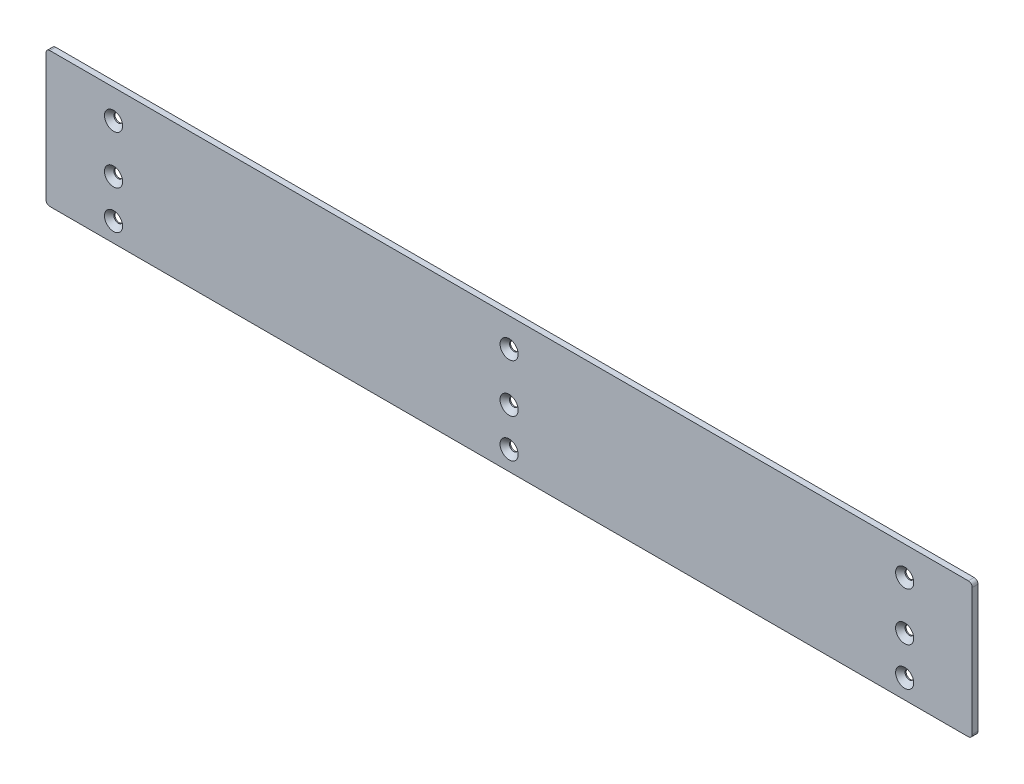
ISO-10303-21;
HEADER;
FILE_DESCRIPTION(('STEP AP214'),'2;1');
FILE_NAME('part.step','',(''),(''),'','','');
FILE_SCHEMA(('AUTOMOTIVE_DESIGN { 1 0 10303 214 1 1 1 1 }'));
ENDSEC;
DATA;
#1=APPLICATION_CONTEXT('core data for automotive mechanical design processes');
#2=APPLICATION_PROTOCOL_DEFINITION('international standard','automotive_design',2000,#1);
#3=PRODUCT_CONTEXT('',#1,'mechanical');
#4=PRODUCT('Part','Part','',(#3));
#5=PRODUCT_RELATED_PRODUCT_CATEGORY('part','',(#4));
#6=PRODUCT_DEFINITION_FORMATION('','',#4);
#7=PRODUCT_DEFINITION_CONTEXT('part definition',#1,'design');
#8=PRODUCT_DEFINITION('design','',#6,#7);
#9=PRODUCT_DEFINITION_SHAPE('','',#8);
#10=(LENGTH_UNIT() NAMED_UNIT(*) SI_UNIT(.MILLI.,.METRE.));
#11=(NAMED_UNIT(*) PLANE_ANGLE_UNIT() SI_UNIT($,.RADIAN.));
#12=(NAMED_UNIT(*) SI_UNIT($,.STERADIAN.) SOLID_ANGLE_UNIT());
#13=UNCERTAINTY_MEASURE_WITH_UNIT(LENGTH_MEASURE(1.E-05),#10,'distance_accuracy_value','');
#14=(GEOMETRIC_REPRESENTATION_CONTEXT(3) GLOBAL_UNCERTAINTY_ASSIGNED_CONTEXT((#13)) GLOBAL_UNIT_ASSIGNED_CONTEXT((#10,
#11,#12)) REPRESENTATION_CONTEXT('',''));
#15=CARTESIAN_POINT('',(0.,0.,0.));
#16=DIRECTION('',(0.,0.,1.));
#17=DIRECTION('',(1.,0.,0.));
#18=AXIS2_PLACEMENT_3D('',#15,#16,#17);
#19=CARTESIAN_POINT('',(-1.4210854715202E-13,0.,1.5));
#20=DIRECTION('',(0.,0.,1.));
#21=DIRECTION('',(1.,0.,0.));
#22=AXIS2_PLACEMENT_3D('',#19,#20,#21);
#23=PLANE('',#22);
#24=CARTESIAN_POINT('',(205.000057018662,-5.,1.5));
#25=DIRECTION('',(0.,0.,-1.));
#26=DIRECTION('',(1.,0.,0.));
#27=AXIS2_PLACEMENT_3D('',#24,#25,#26);
#28=CIRCLE('',#27,4.7);
#29=CARTESIAN_POINT('',(209.700057018662,-5.,1.5));
#30=VERTEX_POINT('',#29);
#31=EDGE_CURVE('E224',#30,#30,#28,.T.);
#32=ORIENTED_EDGE('',*,*,#31,.T.);
#33=EDGE_LOOP('',(#32));
#34=FACE_BOUND('',#33,.T.);
#35=CARTESIAN_POINT('',(-205.000057018662,-5.,1.5));
#36=DIRECTION('',(0.,0.,-1.));
#37=DIRECTION('',(1.,0.,0.));
#38=AXIS2_PLACEMENT_3D('',#35,#36,#37);
#39=CIRCLE('',#38,4.7);
#40=CARTESIAN_POINT('',(-200.300057018662,-5.,1.5));
#41=VERTEX_POINT('',#40);
#42=EDGE_CURVE('E167',#41,#41,#39,.T.);
#43=ORIENTED_EDGE('',*,*,#42,.T.);
#44=EDGE_LOOP('',(#43));
#45=FACE_BOUND('',#44,.T.);
#46=CARTESIAN_POINT('',(0.,20.,1.5));
#47=DIRECTION('',(0.,0.,-1.));
#48=DIRECTION('',(1.,0.,0.));
#49=AXIS2_PLACEMENT_3D('',#46,#47,#48);
#50=CIRCLE('',#49,4.7);
#51=CARTESIAN_POINT('',(4.7,20.,1.5));
#52=VERTEX_POINT('',#51);
#53=EDGE_CURVE('E160',#52,#52,#50,.T.);
#54=ORIENTED_EDGE('',*,*,#53,.T.);
#55=EDGE_LOOP('',(#54));
#56=FACE_BOUND('',#55,.T.);
#57=CARTESIAN_POINT('',(205.000057018662,20.,1.5));
#58=DIRECTION('',(0.,0.,-1.));
#59=DIRECTION('',(1.,0.,0.));
#60=AXIS2_PLACEMENT_3D('',#57,#58,#59);
#61=CIRCLE('',#60,4.7);
#62=CARTESIAN_POINT('',(209.700057018662,20.,1.5));
#63=VERTEX_POINT('',#62);
#64=EDGE_CURVE('E170',#63,#63,#61,.T.);
#65=ORIENTED_EDGE('',*,*,#64,.T.);
#66=EDGE_LOOP('',(#65));
#67=FACE_BOUND('',#66,.T.);
#68=CARTESIAN_POINT('',(-205.000057018662,20.,1.5));
#69=DIRECTION('',(0.,0.,-1.));
#70=DIRECTION('',(1.,0.,0.));
#71=AXIS2_PLACEMENT_3D('',#68,#69,#70);
#72=CIRCLE('',#71,4.7);
#73=CARTESIAN_POINT('',(-200.300057018662,20.,1.5));
#74=VERTEX_POINT('',#73);
#75=EDGE_CURVE('E194',#74,#74,#72,.T.);
#76=ORIENTED_EDGE('',*,*,#75,.T.);
#77=EDGE_LOOP('',(#76));
#78=FACE_BOUND('',#77,.T.);
#79=CARTESIAN_POINT('',(-205.000057018662,-25.,1.5));
#80=DIRECTION('',(0.,0.,-1.));
#81=DIRECTION('',(1.,0.,0.));
#82=AXIS2_PLACEMENT_3D('',#79,#80,#81);
#83=CIRCLE('',#82,4.7);
#84=CARTESIAN_POINT('',(-200.300057018662,-25.,1.5));
#85=VERTEX_POINT('',#84);
#86=EDGE_CURVE('E215',#85,#85,#83,.T.);
#87=ORIENTED_EDGE('',*,*,#86,.T.);
#88=EDGE_LOOP('',(#87));
#89=FACE_BOUND('',#88,.T.);
#90=CARTESIAN_POINT('',(205.000057018662,-25.,1.5));
#91=DIRECTION('',(0.,0.,-1.));
#92=DIRECTION('',(1.,0.,0.));
#93=AXIS2_PLACEMENT_3D('',#90,#91,#92);
#94=CIRCLE('',#93,4.7);
#95=CARTESIAN_POINT('',(209.700057018662,-25.,1.5));
#96=VERTEX_POINT('',#95);
#97=EDGE_CURVE('E198',#96,#96,#94,.T.);
#98=ORIENTED_EDGE('',*,*,#97,.T.);
#99=EDGE_LOOP('',(#98));
#100=FACE_BOUND('',#99,.T.);
#101=CARTESIAN_POINT('',(0.,-25.,1.5));
#102=DIRECTION('',(0.,0.,-1.));
#103=DIRECTION('',(1.,0.,0.));
#104=AXIS2_PLACEMENT_3D('',#101,#102,#103);
#105=CIRCLE('',#104,4.7);
#106=CARTESIAN_POINT('',(4.7,-25.,1.5));
#107=VERTEX_POINT('',#106);
#108=EDGE_CURVE('E183',#107,#107,#105,.T.);
#109=ORIENTED_EDGE('',*,*,#108,.T.);
#110=EDGE_LOOP('',(#109));
#111=FACE_BOUND('',#110,.T.);
#112=CARTESIAN_POINT('',(0.,-5.,1.5));
#113=DIRECTION('',(0.,0.,-1.));
#114=DIRECTION('',(1.,0.,0.));
#115=AXIS2_PLACEMENT_3D('',#112,#113,#114);
#116=CIRCLE('',#115,4.7);
#117=CARTESIAN_POINT('',(4.7,-5.,1.5));
#118=VERTEX_POINT('',#117);
#119=EDGE_CURVE('E184',#118,#118,#116,.T.);
#120=ORIENTED_EDGE('',*,*,#119,.T.);
#121=EDGE_LOOP('',(#120));
#122=FACE_BOUND('',#121,.T.);
#123=CARTESIAN_POINT('',(-238.,33.,1.5));
#124=DIRECTION('',(0.,0.,-1.));
#125=DIRECTION('',(-0.707106781186552,0.707106781186543,0.));
#126=AXIS2_PLACEMENT_3D('',#123,#124,#125);
#127=CIRCLE('',#126,2.);
#128=CARTESIAN_POINT('',(-240.,33.,1.5));
#129=VERTEX_POINT('',#128);
#130=CARTESIAN_POINT('',(-238.,35.,1.5));
#131=VERTEX_POINT('',#130);
#132=EDGE_CURVE('E230',#129,#131,#127,.T.);
#133=ORIENTED_EDGE('',*,*,#132,.F.);
#134=DIRECTION('',(0.,-1.,0.));
#135=VECTOR('',#134,1.);
#136=CARTESIAN_POINT('',(-240.,-35.,1.5));
#137=LINE('',#136,#135);
#138=CARTESIAN_POINT('',(-240.,-33.,1.5));
#139=VERTEX_POINT('',#138);
#140=EDGE_CURVE('E242',#129,#139,#137,.T.);
#141=ORIENTED_EDGE('',*,*,#140,.T.);
#142=CARTESIAN_POINT('',(-238.,-33.,1.5));
#143=DIRECTION('',(0.,0.,-1.));
#144=DIRECTION('',(-0.707106781186552,-0.707106781186543,0.));
#145=AXIS2_PLACEMENT_3D('',#142,#143,#144);
#146=CIRCLE('',#145,2.);
#147=CARTESIAN_POINT('',(-238.,-35.,1.5));
#148=VERTEX_POINT('',#147);
#149=EDGE_CURVE('E222',#148,#139,#146,.T.);
#150=ORIENTED_EDGE('',*,*,#149,.F.);
#151=DIRECTION('',(1.,0.,0.));
#152=VECTOR('',#151,1.);
#153=CARTESIAN_POINT('',(240.,-35.,1.5));
#154=LINE('',#153,#152);
#155=CARTESIAN_POINT('',(238.,-35.,1.5));
#156=VERTEX_POINT('',#155);
#157=EDGE_CURVE('E185',#148,#156,#154,.T.);
#158=ORIENTED_EDGE('',*,*,#157,.T.);
#159=CARTESIAN_POINT('',(238.,-33.,1.5));
#160=DIRECTION('',(0.,0.,-1.));
#161=DIRECTION('',(0.707106781186552,-0.707106781186543,0.));
#162=AXIS2_PLACEMENT_3D('',#159,#160,#161);
#163=CIRCLE('',#162,2.);
#164=CARTESIAN_POINT('',(240.,-33.,1.5));
#165=VERTEX_POINT('',#164);
#166=EDGE_CURVE('E206',#165,#156,#163,.T.);
#167=ORIENTED_EDGE('',*,*,#166,.F.);
#168=DIRECTION('',(0.,1.,0.));
#169=VECTOR('',#168,1.);
#170=CARTESIAN_POINT('',(240.,35.,1.5));
#171=LINE('',#170,#169);
#172=CARTESIAN_POINT('',(240.,33.,1.5));
#173=VERTEX_POINT('',#172);
#174=EDGE_CURVE('E207',#165,#173,#171,.T.);
#175=ORIENTED_EDGE('',*,*,#174,.T.);
#176=CARTESIAN_POINT('',(238.,33.,1.5));
#177=DIRECTION('',(0.,0.,-1.));
#178=DIRECTION('',(0.70710678118654,0.707106781186556,0.));
#179=AXIS2_PLACEMENT_3D('',#176,#177,#178);
#180=CIRCLE('',#179,2.);
#181=CARTESIAN_POINT('',(238.,35.,1.5));
#182=VERTEX_POINT('',#181);
#183=EDGE_CURVE('E214',#182,#173,#180,.T.);
#184=ORIENTED_EDGE('',*,*,#183,.F.);
#185=DIRECTION('',(-1.,0.,0.));
#186=VECTOR('',#185,1.);
#187=CARTESIAN_POINT('',(-240.,35.,1.5));
#188=LINE('',#187,#186);
#189=EDGE_CURVE('E10',#182,#131,#188,.T.);
#190=ORIENTED_EDGE('',*,*,#189,.T.);
#191=EDGE_LOOP('',(#133,#141,#150,#158,#167,#175,#184,#190));
#192=FACE_BOUND('',#191,.T.);
#193=ADVANCED_FACE('F15',(#34,#45,#56,#67,#78,#89,#100,#111,#122,#192),#23,.T.);
#194=CARTESIAN_POINT('',(240.,35.,0.));
#195=DIRECTION('',(0.,1.,0.));
#196=DIRECTION('',(-1.,0.,0.));
#197=AXIS2_PLACEMENT_3D('',#194,#195,#196);
#198=PLANE('',#197);
#199=DIRECTION('',(0.,0.,-1.));
#200=VECTOR('',#199,1.);
#201=CARTESIAN_POINT('',(-238.,35.,0.));
#202=LINE('',#201,#200);
#203=CARTESIAN_POINT('',(-238.,35.,-1.5));
#204=VERTEX_POINT('',#203);
#205=EDGE_CURVE('E233',#131,#204,#202,.T.);
#206=ORIENTED_EDGE('',*,*,#205,.F.);
#207=ORIENTED_EDGE('',*,*,#189,.F.);
#208=DIRECTION('',(0.,0.,1.));
#209=VECTOR('',#208,1.);
#210=CARTESIAN_POINT('',(238.,35.,0.));
#211=LINE('',#210,#209);
#212=CARTESIAN_POINT('',(238.,35.,-1.5));
#213=VERTEX_POINT('',#212);
#214=EDGE_CURVE('E189',#213,#182,#211,.T.);
#215=ORIENTED_EDGE('',*,*,#214,.F.);
#216=DIRECTION('',(1.,0.,0.));
#217=VECTOR('',#216,1.);
#218=CARTESIAN_POINT('',(-240.,35.,-1.5));
#219=LINE('',#218,#217);
#220=EDGE_CURVE('E178',#204,#213,#219,.T.);
#221=ORIENTED_EDGE('',*,*,#220,.F.);
#222=EDGE_LOOP('',(#206,#207,#215,#221));
#223=FACE_BOUND('',#222,.T.);
#224=ADVANCED_FACE('F284',(#223),#198,.T.);
#225=CARTESIAN_POINT('',(205.000057018662,-5.,-483.586590208387));
#226=DIRECTION('',(0.,0.,-1.));
#227=DIRECTION('',(1.,0.,0.));
#228=AXIS2_PLACEMENT_3D('',#225,#226,#227);
#229=CYLINDRICAL_SURFACE('',#228,2.25);
#230=CARTESIAN_POINT('',(205.000057018662,-5.,-0.950000000000045));
#231=DIRECTION('',(0.,0.,1.));
#232=DIRECTION('',(1.,0.,0.));
#233=AXIS2_PLACEMENT_3D('',#230,#231,#232);
#234=CIRCLE('',#233,2.25);
#235=CARTESIAN_POINT('',(207.250057018662,-5.,-0.95));
#236=VERTEX_POINT('',#235);
#237=EDGE_CURVE('E26',#236,#236,#234,.T.);
#238=ORIENTED_EDGE('',*,*,#237,.T.);
#239=EDGE_LOOP('',(#238));
#240=FACE_BOUND('',#239,.T.);
#241=CARTESIAN_POINT('',(205.000057018662,-5.,-1.49999999999999));
#242=DIRECTION('',(0.,0.,1.));
#243=DIRECTION('',(1.,0.,0.));
#244=AXIS2_PLACEMENT_3D('',#241,#242,#243);
#245=CIRCLE('',#244,2.25);
#246=CARTESIAN_POINT('',(202.750057018662,-5.,-1.49999999999999));
#247=VERTEX_POINT('',#246);
#248=EDGE_CURVE('E176',#247,#247,#245,.T.);
#249=ORIENTED_EDGE('',*,*,#248,.F.);
#250=EDGE_LOOP('',(#249));
#251=FACE_BOUND('',#250,.T.);
#252=ADVANCED_FACE('F290',(#240,#251),#229,.F.);
#253=CARTESIAN_POINT('',(205.000057018662,-5.,0.275));
#254=DIRECTION('',(0.,0.,1.));
#255=DIRECTION('',(1.,0.,0.));
#256=AXIS2_PLACEMENT_3D('',#253,#254,#255);
#257=CONICAL_SURFACE('',#256,3.475,0.785398163397448);
#258=ORIENTED_EDGE('',*,*,#237,.F.);
#259=EDGE_LOOP('',(#258));
#260=FACE_BOUND('',#259,.T.);
#261=ORIENTED_EDGE('',*,*,#31,.F.);
#262=EDGE_LOOP('',(#261));
#263=FACE_BOUND('',#262,.T.);
#264=ADVANCED_FACE('F414',(#260,#263),#257,.F.);
#265=CARTESIAN_POINT('',(-205.000057018662,-5.,-483.586590208387));
#266=DIRECTION('',(0.,0.,-1.));
#267=DIRECTION('',(1.,0.,0.));
#268=AXIS2_PLACEMENT_3D('',#265,#266,#267);
#269=CYLINDRICAL_SURFACE('',#268,2.25);
#270=CARTESIAN_POINT('',(-205.000057018662,-5.,-0.950000000000045));
#271=DIRECTION('',(0.,0.,1.));
#272=DIRECTION('',(1.,0.,0.));
#273=AXIS2_PLACEMENT_3D('',#270,#271,#272);
#274=CIRCLE('',#273,2.25);
#275=CARTESIAN_POINT('',(-202.750057018662,-5.,-0.95));
#276=VERTEX_POINT('',#275);
#277=EDGE_CURVE('E226',#276,#276,#274,.T.);
#278=ORIENTED_EDGE('',*,*,#277,.T.);
#279=EDGE_LOOP('',(#278));
#280=FACE_BOUND('',#279,.T.);
#281=CARTESIAN_POINT('',(-205.000057018662,-5.,-1.49999999999999));
#282=DIRECTION('',(0.,0.,1.));
#283=DIRECTION('',(1.,0.,0.));
#284=AXIS2_PLACEMENT_3D('',#281,#282,#283);
#285=CIRCLE('',#284,2.25);
#286=CARTESIAN_POINT('',(-207.250057018662,-5.,-1.49999999999999));
#287=VERTEX_POINT('',#286);
#288=EDGE_CURVE('E179',#287,#287,#285,.T.);
#289=ORIENTED_EDGE('',*,*,#288,.F.);
#290=EDGE_LOOP('',(#289));
#291=FACE_BOUND('',#290,.T.);
#292=ADVANCED_FACE('F412',(#280,#291),#269,.F.);
#293=CARTESIAN_POINT('',(-205.000057018662,-5.,0.275));
#294=DIRECTION('',(0.,0.,1.));
#295=DIRECTION('',(1.,0.,0.));
#296=AXIS2_PLACEMENT_3D('',#293,#294,#295);
#297=CONICAL_SURFACE('',#296,3.475,0.785398163397448);
#298=ORIENTED_EDGE('',*,*,#277,.F.);
#299=EDGE_LOOP('',(#298));
#300=FACE_BOUND('',#299,.T.);
#301=ORIENTED_EDGE('',*,*,#42,.F.);
#302=EDGE_LOOP('',(#301));
#303=FACE_BOUND('',#302,.T.);
#304=ADVANCED_FACE('F17',(#300,#303),#297,.F.);
#305=CARTESIAN_POINT('',(0.,20.,-483.586590208387));
#306=DIRECTION('',(0.,0.,-1.));
#307=DIRECTION('',(1.,0.,0.));
#308=AXIS2_PLACEMENT_3D('',#305,#306,#307);
#309=CYLINDRICAL_SURFACE('',#308,2.25);
#310=CARTESIAN_POINT('',(0.,20.,-0.950000000000045));
#311=DIRECTION('',(0.,0.,1.));
#312=DIRECTION('',(1.,0.,0.));
#313=AXIS2_PLACEMENT_3D('',#310,#311,#312);
#314=CIRCLE('',#313,2.25);
#315=CARTESIAN_POINT('',(2.25,20.,-0.95));
#316=VERTEX_POINT('',#315);
#317=EDGE_CURVE('E163',#316,#316,#314,.T.);
#318=ORIENTED_EDGE('',*,*,#317,.T.);
#319=EDGE_LOOP('',(#318));
#320=FACE_BOUND('',#319,.T.);
#321=CARTESIAN_POINT('',(0.,20.,-1.49999999999999));
#322=DIRECTION('',(0.,0.,1.));
#323=DIRECTION('',(1.,0.,0.));
#324=AXIS2_PLACEMENT_3D('',#321,#322,#323);
#325=CIRCLE('',#324,2.25);
#326=CARTESIAN_POINT('',(-2.25,20.,-1.49999999999999));
#327=VERTEX_POINT('',#326);
#328=EDGE_CURVE('E236',#327,#327,#325,.T.);
#329=ORIENTED_EDGE('',*,*,#328,.F.);
#330=EDGE_LOOP('',(#329));
#331=FACE_BOUND('',#330,.T.);
#332=ADVANCED_FACE('F445',(#320,#331),#309,.F.);
#333=CARTESIAN_POINT('',(0.,20.,0.275));
#334=DIRECTION('',(0.,0.,1.));
#335=DIRECTION('',(1.,0.,0.));
#336=AXIS2_PLACEMENT_3D('',#333,#334,#335);
#337=CONICAL_SURFACE('',#336,3.475,0.785398163397448);
#338=ORIENTED_EDGE('',*,*,#317,.F.);
#339=EDGE_LOOP('',(#338));
#340=FACE_BOUND('',#339,.T.);
#341=ORIENTED_EDGE('',*,*,#53,.F.);
#342=EDGE_LOOP('',(#341));
#343=FACE_BOUND('',#342,.T.);
#344=ADVANCED_FACE('F442',(#340,#343),#337,.F.);
#345=CARTESIAN_POINT('',(205.000057018662,20.,-483.586590208387));
#346=DIRECTION('',(0.,0.,-1.));
#347=DIRECTION('',(1.,0.,0.));
#348=AXIS2_PLACEMENT_3D('',#345,#346,#347);
#349=CYLINDRICAL_SURFACE('',#348,2.25);
#350=CARTESIAN_POINT('',(205.000057018662,20.,-0.950000000000045));
#351=DIRECTION('',(0.,0.,1.));
#352=DIRECTION('',(1.,0.,0.));
#353=AXIS2_PLACEMENT_3D('',#350,#351,#352);
#354=CIRCLE('',#353,2.25);
#355=CARTESIAN_POINT('',(207.250057018662,20.,-0.95));
#356=VERTEX_POINT('',#355);
#357=EDGE_CURVE('E164',#356,#356,#354,.T.);
#358=ORIENTED_EDGE('',*,*,#357,.T.);
#359=EDGE_LOOP('',(#358));
#360=FACE_BOUND('',#359,.T.);
#361=CARTESIAN_POINT('',(205.000057018662,20.,-1.49999999999999));
#362=DIRECTION('',(0.,0.,1.));
#363=DIRECTION('',(1.,0.,0.));
#364=AXIS2_PLACEMENT_3D('',#361,#362,#363);
#365=CIRCLE('',#364,2.25);
#366=CARTESIAN_POINT('',(202.750057018662,20.,-1.49999999999999));
#367=VERTEX_POINT('',#366);
#368=EDGE_CURVE('E234',#367,#367,#365,.T.);
#369=ORIENTED_EDGE('',*,*,#368,.F.);
#370=EDGE_LOOP('',(#369));
#371=FACE_BOUND('',#370,.T.);
#372=ADVANCED_FACE('F278',(#360,#371),#349,.F.);
#373=CARTESIAN_POINT('',(205.000057018662,20.,0.275));
#374=DIRECTION('',(0.,0.,1.));
#375=DIRECTION('',(1.,0.,0.));
#376=AXIS2_PLACEMENT_3D('',#373,#374,#375);
#377=CONICAL_SURFACE('',#376,3.475,0.785398163397448);
#378=ORIENTED_EDGE('',*,*,#357,.F.);
#379=EDGE_LOOP('',(#378));
#380=FACE_BOUND('',#379,.T.);
#381=ORIENTED_EDGE('',*,*,#64,.F.);
#382=EDGE_LOOP('',(#381));
#383=FACE_BOUND('',#382,.T.);
#384=ADVANCED_FACE('F267',(#380,#383),#377,.F.);
#385=CARTESIAN_POINT('',(-205.000057018662,20.,-483.586590208387));
#386=DIRECTION('',(0.,0.,-1.));
#387=DIRECTION('',(1.,0.,0.));
#388=AXIS2_PLACEMENT_3D('',#385,#386,#387);
#389=CYLINDRICAL_SURFACE('',#388,2.25);
#390=CARTESIAN_POINT('',(-205.000057018662,20.,-0.950000000000045));
#391=DIRECTION('',(0.,0.,1.));
#392=DIRECTION('',(1.,0.,0.));
#393=AXIS2_PLACEMENT_3D('',#390,#391,#392);
#394=CIRCLE('',#393,2.25);
#395=CARTESIAN_POINT('',(-202.750057018662,20.,-0.95));
#396=VERTEX_POINT('',#395);
#397=EDGE_CURVE('E196',#396,#396,#394,.T.);
#398=ORIENTED_EDGE('',*,*,#397,.T.);
#399=EDGE_LOOP('',(#398));
#400=FACE_BOUND('',#399,.T.);
#401=CARTESIAN_POINT('',(-205.000057018662,20.,-1.49999999999999));
#402=DIRECTION('',(0.,0.,1.));
#403=DIRECTION('',(1.,0.,0.));
#404=AXIS2_PLACEMENT_3D('',#401,#402,#403);
#405=CIRCLE('',#404,2.25);
#406=CARTESIAN_POINT('',(-207.250057018662,20.,-1.49999999999999));
#407=VERTEX_POINT('',#406);
#408=EDGE_CURVE('E237',#407,#407,#405,.T.);
#409=ORIENTED_EDGE('',*,*,#408,.F.);
#410=EDGE_LOOP('',(#409));
#411=FACE_BOUND('',#410,.T.);
#412=ADVANCED_FACE('F264',(#400,#411),#389,.F.);
#413=CARTESIAN_POINT('',(-205.000057018662,20.,0.275));
#414=DIRECTION('',(0.,0.,1.));
#415=DIRECTION('',(1.,0.,0.));
#416=AXIS2_PLACEMENT_3D('',#413,#414,#415);
#417=CONICAL_SURFACE('',#416,3.475,0.785398163397448);
#418=ORIENTED_EDGE('',*,*,#397,.F.);
#419=EDGE_LOOP('',(#418));
#420=FACE_BOUND('',#419,.T.);
#421=ORIENTED_EDGE('',*,*,#75,.F.);
#422=EDGE_LOOP('',(#421));
#423=FACE_BOUND('',#422,.T.);
#424=ADVANCED_FACE('F266',(#420,#423),#417,.F.);
#425=CARTESIAN_POINT('',(-205.000057018662,-25.,-483.586590208387));
#426=DIRECTION('',(0.,0.,-1.));
#427=DIRECTION('',(1.,0.,0.));
#428=AXIS2_PLACEMENT_3D('',#425,#426,#427);
#429=CYLINDRICAL_SURFACE('',#428,2.25);
#430=CARTESIAN_POINT('',(-205.000057018662,-25.,-0.950000000000045));
#431=DIRECTION('',(0.,0.,1.));
#432=DIRECTION('',(1.,0.,0.));
#433=AXIS2_PLACEMENT_3D('',#430,#431,#432);
#434=CIRCLE('',#433,2.25);
#435=CARTESIAN_POINT('',(-202.750057018662,-25.,-0.95));
#436=VERTEX_POINT('',#435);
#437=EDGE_CURVE('E197',#436,#436,#434,.T.);
#438=ORIENTED_EDGE('',*,*,#437,.T.);
#439=EDGE_LOOP('',(#438));
#440=FACE_BOUND('',#439,.T.);
#441=CARTESIAN_POINT('',(-205.000057018662,-25.,-1.49999999999999));
#442=DIRECTION('',(0.,0.,1.));
#443=DIRECTION('',(1.,0.,0.));
#444=AXIS2_PLACEMENT_3D('',#441,#442,#443);
#445=CIRCLE('',#444,2.25);
#446=CARTESIAN_POINT('',(-207.250057018662,-25.,-1.49999999999999));
#447=VERTEX_POINT('',#446);
#448=EDGE_CURVE('E258',#447,#447,#445,.T.);
#449=ORIENTED_EDGE('',*,*,#448,.F.);
#450=EDGE_LOOP('',(#449));
#451=FACE_BOUND('',#450,.T.);
#452=ADVANCED_FACE('F275',(#440,#451),#429,.F.);
#453=CARTESIAN_POINT('',(-205.000057018662,-25.,0.275));
#454=DIRECTION('',(0.,0.,1.));
#455=DIRECTION('',(1.,0.,0.));
#456=AXIS2_PLACEMENT_3D('',#453,#454,#455);
#457=CONICAL_SURFACE('',#456,3.475,0.785398163397448);
#458=ORIENTED_EDGE('',*,*,#437,.F.);
#459=EDGE_LOOP('',(#458));
#460=FACE_BOUND('',#459,.T.);
#461=ORIENTED_EDGE('',*,*,#86,.F.);
#462=EDGE_LOOP('',(#461));
#463=FACE_BOUND('',#462,.T.);
#464=ADVANCED_FACE('F298',(#460,#463),#457,.F.);
#465=CARTESIAN_POINT('',(205.000057018662,-25.,-483.586590208387));
#466=DIRECTION('',(0.,0.,-1.));
#467=DIRECTION('',(1.,0.,0.));
#468=AXIS2_PLACEMENT_3D('',#465,#466,#467);
#469=CYLINDRICAL_SURFACE('',#468,2.25);
#470=CARTESIAN_POINT('',(205.000057018662,-25.,-0.950000000000045));
#471=DIRECTION('',(0.,0.,1.));
#472=DIRECTION('',(1.,0.,0.));
#473=AXIS2_PLACEMENT_3D('',#470,#471,#472);
#474=CIRCLE('',#473,2.25);
#475=CARTESIAN_POINT('',(207.250057018662,-25.,-0.95));
#476=VERTEX_POINT('',#475);
#477=EDGE_CURVE('E200',#476,#476,#474,.T.);
#478=ORIENTED_EDGE('',*,*,#477,.T.);
#479=EDGE_LOOP('',(#478));
#480=FACE_BOUND('',#479,.T.);
#481=CARTESIAN_POINT('',(205.000057018662,-25.,-1.49999999999999));
#482=DIRECTION('',(0.,0.,1.));
#483=DIRECTION('',(1.,0.,0.));
#484=AXIS2_PLACEMENT_3D('',#481,#482,#483);
#485=CIRCLE('',#484,2.25);
#486=CARTESIAN_POINT('',(202.750057018662,-25.,-1.49999999999999));
#487=VERTEX_POINT('',#486);
#488=EDGE_CURVE('E192',#487,#487,#485,.T.);
#489=ORIENTED_EDGE('',*,*,#488,.F.);
#490=EDGE_LOOP('',(#489));
#491=FACE_BOUND('',#490,.T.);
#492=ADVANCED_FACE('F303',(#480,#491),#469,.F.);
#493=CARTESIAN_POINT('',(205.000057018662,-25.,0.275));
#494=DIRECTION('',(0.,0.,1.));
#495=DIRECTION('',(1.,0.,0.));
#496=AXIS2_PLACEMENT_3D('',#493,#494,#495);
#497=CONICAL_SURFACE('',#496,3.475,0.785398163397448);
#498=ORIENTED_EDGE('',*,*,#477,.F.);
#499=EDGE_LOOP('',(#498));
#500=FACE_BOUND('',#499,.T.);
#501=ORIENTED_EDGE('',*,*,#97,.F.);
#502=EDGE_LOOP('',(#501));
#503=FACE_BOUND('',#502,.T.);
#504=ADVANCED_FACE('F429',(#500,#503),#497,.F.);
#505=CARTESIAN_POINT('',(0.,-25.,-483.586590208387));
#506=DIRECTION('',(0.,0.,-1.));
#507=DIRECTION('',(1.,0.,0.));
#508=AXIS2_PLACEMENT_3D('',#505,#506,#507);
#509=CYLINDRICAL_SURFACE('',#508,2.25);
#510=CARTESIAN_POINT('',(0.,-25.,-0.950000000000045));
#511=DIRECTION('',(0.,0.,1.));
#512=DIRECTION('',(1.,0.,0.));
#513=AXIS2_PLACEMENT_3D('',#510,#511,#512);
#514=CIRCLE('',#513,2.25);
#515=CARTESIAN_POINT('',(2.25,-25.,-0.95));
#516=VERTEX_POINT('',#515);
#517=EDGE_CURVE('E201',#516,#516,#514,.T.);
#518=ORIENTED_EDGE('',*,*,#517,.T.);
#519=EDGE_LOOP('',(#518));
#520=FACE_BOUND('',#519,.T.);
#521=CARTESIAN_POINT('',(0.,-25.,-1.49999999999999));
#522=DIRECTION('',(0.,0.,1.));
#523=DIRECTION('',(1.,0.,0.));
#524=AXIS2_PLACEMENT_3D('',#521,#522,#523);
#525=CIRCLE('',#524,2.25);
#526=CARTESIAN_POINT('',(-2.25,-25.,-1.49999999999999));
#527=VERTEX_POINT('',#526);
#528=EDGE_CURVE('E190',#527,#527,#525,.T.);
#529=ORIENTED_EDGE('',*,*,#528,.F.);
#530=EDGE_LOOP('',(#529));
#531=FACE_BOUND('',#530,.T.);
#532=ADVANCED_FACE('F373',(#520,#531),#509,.F.);
#533=CARTESIAN_POINT('',(0.,-25.,0.275));
#534=DIRECTION('',(0.,0.,1.));
#535=DIRECTION('',(1.,0.,0.));
#536=AXIS2_PLACEMENT_3D('',#533,#534,#535);
#537=CONICAL_SURFACE('',#536,3.475,0.785398163397448);
#538=ORIENTED_EDGE('',*,*,#517,.F.);
#539=EDGE_LOOP('',(#538));
#540=FACE_BOUND('',#539,.T.);
#541=ORIENTED_EDGE('',*,*,#108,.F.);
#542=EDGE_LOOP('',(#541));
#543=FACE_BOUND('',#542,.T.);
#544=ADVANCED_FACE('F368',(#540,#543),#537,.F.);
#545=CARTESIAN_POINT('',(0.,-5.,-483.586590208387));
#546=DIRECTION('',(0.,0.,-1.));
#547=DIRECTION('',(1.,0.,0.));
#548=AXIS2_PLACEMENT_3D('',#545,#546,#547);
#549=CYLINDRICAL_SURFACE('',#548,2.25);
#550=CARTESIAN_POINT('',(0.,-5.,-0.950000000000045));
#551=DIRECTION('',(0.,0.,1.));
#552=DIRECTION('',(1.,0.,0.));
#553=AXIS2_PLACEMENT_3D('',#550,#551,#552);
#554=CIRCLE('',#553,2.25);
#555=CARTESIAN_POINT('',(2.25,-5.,-0.95));
#556=VERTEX_POINT('',#555);
#557=EDGE_CURVE('E180',#556,#556,#554,.T.);
#558=ORIENTED_EDGE('',*,*,#557,.T.);
#559=EDGE_LOOP('',(#558));
#560=FACE_BOUND('',#559,.T.);
#561=CARTESIAN_POINT('',(0.,-5.,-1.49999999999999));
#562=DIRECTION('',(0.,0.,1.));
#563=DIRECTION('',(1.,0.,0.));
#564=AXIS2_PLACEMENT_3D('',#561,#562,#563);
#565=CIRCLE('',#564,2.25);
#566=CARTESIAN_POINT('',(-2.25,-5.,-1.49999999999999));
#567=VERTEX_POINT('',#566);
#568=EDGE_CURVE('E193',#567,#567,#565,.T.);
#569=ORIENTED_EDGE('',*,*,#568,.F.);
#570=EDGE_LOOP('',(#569));
#571=FACE_BOUND('',#570,.T.);
#572=ADVANCED_FACE('F365',(#560,#571),#549,.F.);
#573=CARTESIAN_POINT('',(0.,-5.,0.275));
#574=DIRECTION('',(0.,0.,1.));
#575=DIRECTION('',(1.,0.,0.));
#576=AXIS2_PLACEMENT_3D('',#573,#574,#575);
#577=CONICAL_SURFACE('',#576,3.475,0.785398163397448);
#578=ORIENTED_EDGE('',*,*,#557,.F.);
#579=EDGE_LOOP('',(#578));
#580=FACE_BOUND('',#579,.T.);
#581=ORIENTED_EDGE('',*,*,#119,.F.);
#582=EDGE_LOOP('',(#581));
#583=FACE_BOUND('',#582,.T.);
#584=ADVANCED_FACE('F295',(#580,#583),#577,.F.);
#585=CARTESIAN_POINT('',(238.,-33.,0.));
#586=DIRECTION('',(0.,0.,1.));
#587=DIRECTION('',(0.707106781186552,-0.707106781186543,0.));
#588=AXIS2_PLACEMENT_3D('',#585,#586,#587);
#589=CYLINDRICAL_SURFACE('',#588,2.);
#590=CARTESIAN_POINT('',(238.,-33.,-1.5));
#591=DIRECTION('',(0.,0.,1.));
#592=DIRECTION('',(0.707106781186552,-0.707106781186543,0.));
#593=AXIS2_PLACEMENT_3D('',#590,#591,#592);
#594=CIRCLE('',#593,2.);
#595=CARTESIAN_POINT('',(238.,-35.,-1.5));
#596=VERTEX_POINT('',#595);
#597=CARTESIAN_POINT('',(240.,-33.,-1.5));
#598=VERTEX_POINT('',#597);
#599=EDGE_CURVE('E257',#596,#598,#594,.T.);
#600=ORIENTED_EDGE('',*,*,#599,.T.);
#601=DIRECTION('',(0.,0.,1.));
#602=VECTOR('',#601,1.);
#603=CARTESIAN_POINT('',(240.,-33.,0.));
#604=LINE('',#603,#602);
#605=EDGE_CURVE('E203',#598,#165,#604,.T.);
#606=ORIENTED_EDGE('',*,*,#605,.T.);
#607=ORIENTED_EDGE('',*,*,#166,.T.);
#608=DIRECTION('',(0.,0.,-1.));
#609=VECTOR('',#608,1.);
#610=CARTESIAN_POINT('',(238.,-35.,0.));
#611=LINE('',#610,#609);
#612=EDGE_CURVE('E19',#156,#596,#611,.T.);
#613=ORIENTED_EDGE('',*,*,#612,.T.);
#614=EDGE_LOOP('',(#600,#606,#607,#613));
#615=FACE_BOUND('',#614,.T.);
#616=ADVANCED_FACE('F356',(#615),#589,.T.);
#617=CARTESIAN_POINT('',(240.,-35.,0.));
#618=DIRECTION('',(1.,0.,0.));
#619=DIRECTION('',(0.,1.,0.));
#620=AXIS2_PLACEMENT_3D('',#617,#618,#619);
#621=PLANE('',#620);
#622=DIRECTION('',(0.,0.,-1.));
#623=VECTOR('',#622,1.);
#624=CARTESIAN_POINT('',(240.,33.,0.));
#625=LINE('',#624,#623);
#626=CARTESIAN_POINT('',(240.,33.,-1.5));
#627=VERTEX_POINT('',#626);
#628=EDGE_CURVE('E212',#173,#627,#625,.T.);
#629=ORIENTED_EDGE('',*,*,#628,.F.);
#630=ORIENTED_EDGE('',*,*,#174,.F.);
#631=ORIENTED_EDGE('',*,*,#605,.F.);
#632=DIRECTION('',(0.,-1.,0.));
#633=VECTOR('',#632,1.);
#634=CARTESIAN_POINT('',(240.,35.,-1.5));
#635=LINE('',#634,#633);
#636=EDGE_CURVE('E211',#627,#598,#635,.T.);
#637=ORIENTED_EDGE('',*,*,#636,.F.);
#638=EDGE_LOOP('',(#629,#630,#631,#637));
#639=FACE_BOUND('',#638,.T.);
#640=ADVANCED_FACE('F353',(#639),#621,.T.);
#641=CARTESIAN_POINT('',(238.,33.,0.));
#642=DIRECTION('',(0.,0.,1.));
#643=DIRECTION('',(0.70710678118654,0.707106781186556,0.));
#644=AXIS2_PLACEMENT_3D('',#641,#642,#643);
#645=CYLINDRICAL_SURFACE('',#644,2.);
#646=CARTESIAN_POINT('',(238.,33.,-1.5));
#647=DIRECTION('',(0.,0.,1.));
#648=DIRECTION('',(0.70710678118654,0.707106781186556,0.));
#649=AXIS2_PLACEMENT_3D('',#646,#647,#648);
#650=CIRCLE('',#649,2.);
#651=EDGE_CURVE('E208',#627,#213,#650,.T.);
#652=ORIENTED_EDGE('',*,*,#651,.T.);
#653=ORIENTED_EDGE('',*,*,#214,.T.);
#654=ORIENTED_EDGE('',*,*,#183,.T.);
#655=ORIENTED_EDGE('',*,*,#628,.T.);
#656=EDGE_LOOP('',(#652,#653,#654,#655));
#657=FACE_BOUND('',#656,.T.);
#658=ADVANCED_FACE('F363',(#657),#645,.T.);
#659=CARTESIAN_POINT('',(-240.,-35.,0.));
#660=DIRECTION('',(0.,-1.,0.));
#661=DIRECTION('',(1.,0.,0.));
#662=AXIS2_PLACEMENT_3D('',#659,#660,#661);
#663=PLANE('',#662);
#664=DIRECTION('',(0.,0.,1.));
#665=VECTOR('',#664,1.);
#666=CARTESIAN_POINT('',(-238.,-35.,0.));
#667=LINE('',#666,#665);
#668=CARTESIAN_POINT('',(-238.,-35.,-1.5));
#669=VERTEX_POINT('',#668);
#670=EDGE_CURVE('E115',#669,#148,#667,.T.);
#671=ORIENTED_EDGE('',*,*,#670,.F.);
#672=DIRECTION('',(-1.,0.,0.));
#673=VECTOR('',#672,1.);
#674=CARTESIAN_POINT('',(240.,-35.,-1.5));
#675=LINE('',#674,#673);
#676=EDGE_CURVE('E253',#596,#669,#675,.T.);
#677=ORIENTED_EDGE('',*,*,#676,.F.);
#678=ORIENTED_EDGE('',*,*,#612,.F.);
#679=ORIENTED_EDGE('',*,*,#157,.F.);
#680=EDGE_LOOP('',(#671,#677,#678,#679));
#681=FACE_BOUND('',#680,.T.);
#682=ADVANCED_FACE('F394',(#681),#663,.T.);
#683=CARTESIAN_POINT('',(-238.,-33.,0.));
#684=DIRECTION('',(0.,0.,1.));
#685=DIRECTION('',(-0.707106781186552,-0.707106781186543,0.));
#686=AXIS2_PLACEMENT_3D('',#683,#684,#685);
#687=CYLINDRICAL_SURFACE('',#686,2.);
#688=CARTESIAN_POINT('',(-238.,-33.,-1.5));
#689=DIRECTION('',(0.,0.,1.));
#690=DIRECTION('',(-0.707106781186552,-0.707106781186543,0.));
#691=AXIS2_PLACEMENT_3D('',#688,#689,#690);
#692=CIRCLE('',#691,2.);
#693=CARTESIAN_POINT('',(-240.,-33.,-1.5));
#694=VERTEX_POINT('',#693);
#695=EDGE_CURVE('E223',#694,#669,#692,.T.);
#696=ORIENTED_EDGE('',*,*,#695,.T.);
#697=ORIENTED_EDGE('',*,*,#670,.T.);
#698=ORIENTED_EDGE('',*,*,#149,.T.);
#699=DIRECTION('',(0.,0.,-1.));
#700=VECTOR('',#699,1.);
#701=CARTESIAN_POINT('',(-240.,-33.,0.));
#702=LINE('',#701,#700);
#703=EDGE_CURVE('E246',#139,#694,#702,.T.);
#704=ORIENTED_EDGE('',*,*,#703,.T.);
#705=EDGE_LOOP('',(#696,#697,#698,#704));
#706=FACE_BOUND('',#705,.T.);
#707=ADVANCED_FACE('F312',(#706),#687,.T.);
#708=CARTESIAN_POINT('',(-1.4210854715202E-13,0.,-1.5));
#709=DIRECTION('',(0.,0.,-1.));
#710=DIRECTION('',(-1.,0.,0.));
#711=AXIS2_PLACEMENT_3D('',#708,#709,#710);
#712=PLANE('',#711);
#713=CARTESIAN_POINT('',(-238.,33.,-1.5));
#714=DIRECTION('',(0.,0.,1.));
#715=DIRECTION('',(-0.707106781186552,0.707106781186543,0.));
#716=AXIS2_PLACEMENT_3D('',#713,#714,#715);
#717=CIRCLE('',#716,2.);
#718=CARTESIAN_POINT('',(-240.,33.,-1.5));
#719=VERTEX_POINT('',#718);
#720=EDGE_CURVE('E326',#204,#719,#717,.T.);
#721=ORIENTED_EDGE('',*,*,#720,.F.);
#722=ORIENTED_EDGE('',*,*,#220,.T.);
#723=ORIENTED_EDGE('',*,*,#651,.F.);
#724=ORIENTED_EDGE('',*,*,#636,.T.);
#725=ORIENTED_EDGE('',*,*,#599,.F.);
#726=ORIENTED_EDGE('',*,*,#676,.T.);
#727=ORIENTED_EDGE('',*,*,#695,.F.);
#728=DIRECTION('',(0.,1.,0.));
#729=VECTOR('',#728,1.);
#730=CARTESIAN_POINT('',(-240.,-35.,-1.5));
#731=LINE('',#730,#729);
#732=EDGE_CURVE('E248',#694,#719,#731,.T.);
#733=ORIENTED_EDGE('',*,*,#732,.T.);
#734=EDGE_LOOP('',(#721,#722,#723,#724,#725,#726,#727,#733));
#735=FACE_BOUND('',#734,.T.);
#736=ORIENTED_EDGE('',*,*,#248,.T.);
#737=EDGE_LOOP('',(#736));
#738=FACE_BOUND('',#737,.T.);
#739=ORIENTED_EDGE('',*,*,#288,.T.);
#740=EDGE_LOOP('',(#739));
#741=FACE_BOUND('',#740,.T.);
#742=ORIENTED_EDGE('',*,*,#328,.T.);
#743=EDGE_LOOP('',(#742));
#744=FACE_BOUND('',#743,.T.);
#745=ORIENTED_EDGE('',*,*,#368,.T.);
#746=EDGE_LOOP('',(#745));
#747=FACE_BOUND('',#746,.T.);
#748=ORIENTED_EDGE('',*,*,#408,.T.);
#749=EDGE_LOOP('',(#748));
#750=FACE_BOUND('',#749,.T.);
#751=ORIENTED_EDGE('',*,*,#448,.T.);
#752=EDGE_LOOP('',(#751));
#753=FACE_BOUND('',#752,.T.);
#754=ORIENTED_EDGE('',*,*,#488,.T.);
#755=EDGE_LOOP('',(#754));
#756=FACE_BOUND('',#755,.T.);
#757=ORIENTED_EDGE('',*,*,#528,.T.);
#758=EDGE_LOOP('',(#757));
#759=FACE_BOUND('',#758,.T.);
#760=ORIENTED_EDGE('',*,*,#568,.T.);
#761=EDGE_LOOP('',(#760));
#762=FACE_BOUND('',#761,.T.);
#763=ADVANCED_FACE('F261',(#735,#738,#741,#744,#747,#750,#753,#756,#759,#762),#712,.T.);
#764=CARTESIAN_POINT('',(-240.,35.,0.));
#765=DIRECTION('',(-1.,0.,0.));
#766=DIRECTION('',(0.,-1.,0.));
#767=AXIS2_PLACEMENT_3D('',#764,#765,#766);
#768=PLANE('',#767);
#769=DIRECTION('',(0.,0.,1.));
#770=VECTOR('',#769,1.);
#771=CARTESIAN_POINT('',(-240.,33.,0.));
#772=LINE('',#771,#770);
#773=EDGE_CURVE('E174',#719,#129,#772,.T.);
#774=ORIENTED_EDGE('',*,*,#773,.F.);
#775=ORIENTED_EDGE('',*,*,#732,.F.);
#776=ORIENTED_EDGE('',*,*,#703,.F.);
#777=ORIENTED_EDGE('',*,*,#140,.F.);
#778=EDGE_LOOP('',(#774,#775,#776,#777));
#779=FACE_BOUND('',#778,.T.);
#780=ADVANCED_FACE('F311',(#779),#768,.T.);
#781=CARTESIAN_POINT('',(-238.,33.,0.));
#782=DIRECTION('',(0.,0.,-1.));
#783=DIRECTION('',(-0.707106781186552,0.707106781186543,0.));
#784=AXIS2_PLACEMENT_3D('',#781,#782,#783);
#785=CYLINDRICAL_SURFACE('',#784,2.);
#786=ORIENTED_EDGE('',*,*,#132,.T.);
#787=ORIENTED_EDGE('',*,*,#205,.T.);
#788=ORIENTED_EDGE('',*,*,#720,.T.);
#789=ORIENTED_EDGE('',*,*,#773,.T.);
#790=EDGE_LOOP('',(#786,#787,#788,#789));
#791=FACE_BOUND('',#790,.T.);
#792=ADVANCED_FACE('F402',(#791),#785,.T.);
#793=CLOSED_SHELL('',(#193,#224,#252,#264,#292,#304,#332,#344,#372,#384,#412,#424,#452,#464,
#492,#504,#532,#544,#572,#584,#616,#640,#658,#682,#707,#763,#780,#792));
#794=MANIFOLD_SOLID_BREP('B1',#793);
#795=ADVANCED_BREP_SHAPE_REPRESENTATION('',(#18,#794),#14);
#796=SHAPE_DEFINITION_REPRESENTATION(#9,#795);
ENDSEC;
END-ISO-10303-21;
